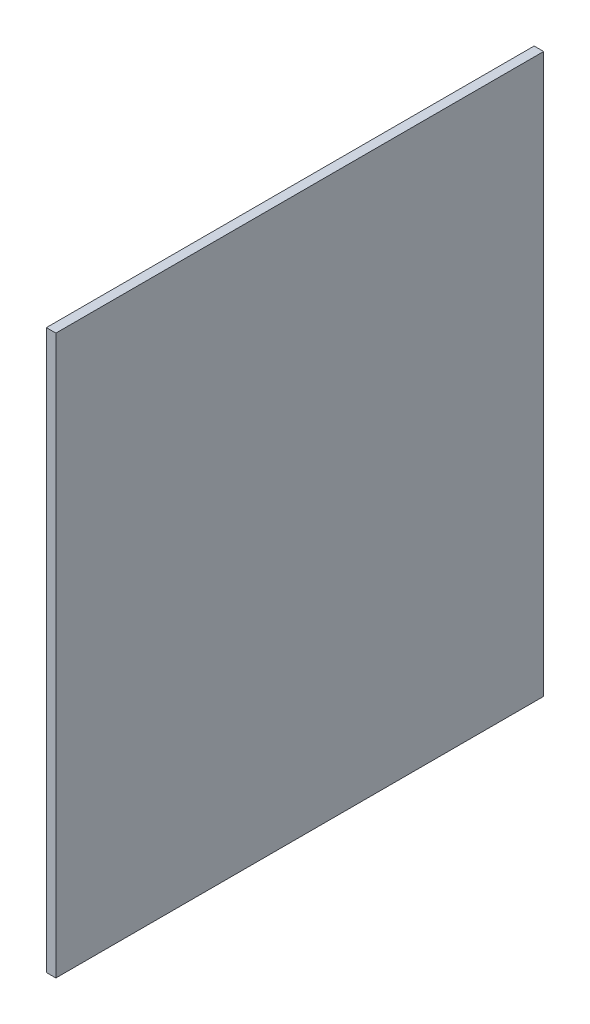
ISO-10303-21;
HEADER;
FILE_DESCRIPTION(('STEP AP214'),'2;1');
FILE_NAME('part.step','',(''),(''),'','','');
FILE_SCHEMA(('AUTOMOTIVE_DESIGN { 1 0 10303 214 1 1 1 1 }'));
ENDSEC;
DATA;
#1=APPLICATION_CONTEXT('core data for automotive mechanical design processes');
#2=APPLICATION_PROTOCOL_DEFINITION('international standard','automotive_design',2000,#1);
#3=PRODUCT_CONTEXT('',#1,'mechanical');
#4=PRODUCT('Part','Part','',(#3));
#5=PRODUCT_RELATED_PRODUCT_CATEGORY('part','',(#4));
#6=PRODUCT_DEFINITION_FORMATION('','',#4);
#7=PRODUCT_DEFINITION_CONTEXT('part definition',#1,'design');
#8=PRODUCT_DEFINITION('design','',#6,#7);
#9=PRODUCT_DEFINITION_SHAPE('','',#8);
#10=(LENGTH_UNIT() NAMED_UNIT(*) SI_UNIT(.MILLI.,.METRE.));
#11=(NAMED_UNIT(*) PLANE_ANGLE_UNIT() SI_UNIT($,.RADIAN.));
#12=(NAMED_UNIT(*) SI_UNIT($,.STERADIAN.) SOLID_ANGLE_UNIT());
#13=UNCERTAINTY_MEASURE_WITH_UNIT(LENGTH_MEASURE(1.E-05),#10,'distance_accuracy_value','');
#14=(GEOMETRIC_REPRESENTATION_CONTEXT(3) GLOBAL_UNCERTAINTY_ASSIGNED_CONTEXT((#13)) GLOBAL_UNIT_ASSIGNED_CONTEXT((#10,
#11,#12)) REPRESENTATION_CONTEXT('',''));
#15=CARTESIAN_POINT('',(0.,0.,0.));
#16=DIRECTION('',(0.,0.,1.));
#17=DIRECTION('',(1.,0.,0.));
#18=AXIS2_PLACEMENT_3D('',#15,#16,#17);
#19=CARTESIAN_POINT('',(2.54,0.,0.));
#20=DIRECTION('',(0.,0.,-1.));
#21=DIRECTION('',(-1.,0.,0.));
#22=AXIS2_PLACEMENT_3D('',#19,#20,#21);
#23=PLANE('',#22);
#24=DIRECTION('',(0.,-1.,0.));
#25=VECTOR('',#24,1.);
#26=CARTESIAN_POINT('',(0.,0.,0.));
#27=LINE('',#26,#25);
#28=CARTESIAN_POINT('',(0.,149.2,0.));
#29=VERTEX_POINT('',#28);
#30=CARTESIAN_POINT('',(0.,0.,0.));
#31=VERTEX_POINT('',#30);
#32=EDGE_CURVE('E96',#29,#31,#27,.T.);
#33=ORIENTED_EDGE('',*,*,#32,.T.);
#34=DIRECTION('',(-1.,0.,0.));
#35=VECTOR('',#34,1.);
#36=CARTESIAN_POINT('',(2.54,0.,0.));
#37=LINE('',#36,#35);
#38=CARTESIAN_POINT('',(2.54,0.,0.));
#39=VERTEX_POINT('',#38);
#40=EDGE_CURVE('E11',#39,#31,#37,.T.);
#41=ORIENTED_EDGE('',*,*,#40,.F.);
#42=DIRECTION('',(0.,-1.,0.));
#43=VECTOR('',#42,1.);
#44=CARTESIAN_POINT('',(2.54,0.,0.));
#45=LINE('',#44,#43);
#46=CARTESIAN_POINT('',(2.54,149.2,0.));
#47=VERTEX_POINT('',#46);
#48=EDGE_CURVE('E84',#47,#39,#45,.T.);
#49=ORIENTED_EDGE('',*,*,#48,.F.);
#50=DIRECTION('',(-1.,0.,0.));
#51=VECTOR('',#50,1.);
#52=CARTESIAN_POINT('',(2.54,149.2,0.));
#53=LINE('',#52,#51);
#54=EDGE_CURVE('E92',#47,#29,#53,.T.);
#55=ORIENTED_EDGE('',*,*,#54,.T.);
#56=EDGE_LOOP('',(#33,#41,#49,#55));
#57=FACE_BOUND('',#56,.T.);
#58=ADVANCED_FACE('F33',(#57),#23,.F.);
#59=CARTESIAN_POINT('',(2.54,0.,0.));
#60=DIRECTION('',(0.,1.,0.));
#61=DIRECTION('',(0.,0.,1.));
#62=AXIS2_PLACEMENT_3D('',#59,#60,#61);
#63=PLANE('',#62);
#64=DIRECTION('',(0.,0.,-1.));
#65=VECTOR('',#64,1.);
#66=CARTESIAN_POINT('',(0.,0.,0.));
#67=LINE('',#66,#65);
#68=CARTESIAN_POINT('',(0.,0.,-130.3));
#69=VERTEX_POINT('',#68);
#70=EDGE_CURVE('E88',#31,#69,#67,.T.);
#71=ORIENTED_EDGE('',*,*,#70,.T.);
#72=DIRECTION('',(-1.,0.,0.));
#73=VECTOR('',#72,1.);
#74=CARTESIAN_POINT('',(2.54,0.,-130.3));
#75=LINE('',#74,#73);
#76=CARTESIAN_POINT('',(2.54,0.,-130.3));
#77=VERTEX_POINT('',#76);
#78=EDGE_CURVE('E41',#77,#69,#75,.T.);
#79=ORIENTED_EDGE('',*,*,#78,.F.);
#80=DIRECTION('',(0.,0.,-1.));
#81=VECTOR('',#80,1.);
#82=CARTESIAN_POINT('',(2.54,0.,0.));
#83=LINE('',#82,#81);
#84=EDGE_CURVE('E79',#39,#77,#83,.T.);
#85=ORIENTED_EDGE('',*,*,#84,.F.);
#86=ORIENTED_EDGE('',*,*,#40,.T.);
#87=EDGE_LOOP('',(#71,#79,#85,#86));
#88=FACE_BOUND('',#87,.T.);
#89=ADVANCED_FACE('F87',(#88),#63,.F.);
#90=CARTESIAN_POINT('',(2.54,0.,-130.3));
#91=DIRECTION('',(0.,0.,1.));
#92=DIRECTION('',(0.,-1.,0.));
#93=AXIS2_PLACEMENT_3D('',#90,#91,#92);
#94=PLANE('',#93);
#95=DIRECTION('',(0.,1.,0.));
#96=VECTOR('',#95,1.);
#97=CARTESIAN_POINT('',(0.,0.,-130.3));
#98=LINE('',#97,#96);
#99=CARTESIAN_POINT('',(0.,149.2,-130.3));
#100=VERTEX_POINT('',#99);
#101=EDGE_CURVE('E66',#69,#100,#98,.T.);
#102=ORIENTED_EDGE('',*,*,#101,.T.);
#103=DIRECTION('',(-1.,0.,0.));
#104=VECTOR('',#103,1.);
#105=CARTESIAN_POINT('',(2.54,149.2,-130.3));
#106=LINE('',#105,#104);
#107=CARTESIAN_POINT('',(2.54,149.2,-130.3));
#108=VERTEX_POINT('',#107);
#109=EDGE_CURVE('E89',#108,#100,#106,.T.);
#110=ORIENTED_EDGE('',*,*,#109,.F.);
#111=DIRECTION('',(0.,1.,0.));
#112=VECTOR('',#111,1.);
#113=CARTESIAN_POINT('',(2.54,0.,-130.3));
#114=LINE('',#113,#112);
#115=EDGE_CURVE('E82',#77,#108,#114,.T.);
#116=ORIENTED_EDGE('',*,*,#115,.F.);
#117=ORIENTED_EDGE('',*,*,#78,.T.);
#118=EDGE_LOOP('',(#102,#110,#116,#117));
#119=FACE_BOUND('',#118,.T.);
#120=ADVANCED_FACE('F90',(#119),#94,.F.);
#121=CARTESIAN_POINT('',(2.54,149.2,0.));
#122=DIRECTION('',(0.,-1.,0.));
#123=DIRECTION('',(0.,0.,-1.));
#124=AXIS2_PLACEMENT_3D('',#121,#122,#123);
#125=PLANE('',#124);
#126=DIRECTION('',(0.,0.,1.));
#127=VECTOR('',#126,1.);
#128=CARTESIAN_POINT('',(0.,149.2,0.));
#129=LINE('',#128,#127);
#130=EDGE_CURVE('E72',#100,#29,#129,.T.);
#131=ORIENTED_EDGE('',*,*,#130,.T.);
#132=ORIENTED_EDGE('',*,*,#54,.F.);
#133=DIRECTION('',(0.,0.,1.));
#134=VECTOR('',#133,1.);
#135=CARTESIAN_POINT('',(2.54,149.2,0.));
#136=LINE('',#135,#134);
#137=EDGE_CURVE('E49',#108,#47,#136,.T.);
#138=ORIENTED_EDGE('',*,*,#137,.F.);
#139=ORIENTED_EDGE('',*,*,#109,.T.);
#140=EDGE_LOOP('',(#131,#132,#138,#139));
#141=FACE_BOUND('',#140,.T.);
#142=ADVANCED_FACE('F103',(#141),#125,.F.);
#143=CARTESIAN_POINT('',(2.54,0.,0.));
#144=DIRECTION('',(-1.,0.,0.));
#145=DIRECTION('',(0.,0.,1.));
#146=AXIS2_PLACEMENT_3D('',#143,#144,#145);
#147=PLANE('',#146);
#148=ORIENTED_EDGE('',*,*,#48,.T.);
#149=ORIENTED_EDGE('',*,*,#84,.T.);
#150=ORIENTED_EDGE('',*,*,#115,.T.);
#151=ORIENTED_EDGE('',*,*,#137,.T.);
#152=EDGE_LOOP('',(#148,#149,#150,#151));
#153=FACE_BOUND('',#152,.T.);
#154=ADVANCED_FACE('F80',(#153),#147,.F.);
#155=CARTESIAN_POINT('',(0.,0.,0.));
#156=DIRECTION('',(-1.,0.,0.));
#157=DIRECTION('',(0.,0.,1.));
#158=AXIS2_PLACEMENT_3D('',#155,#156,#157);
#159=PLANE('',#158);
#160=ORIENTED_EDGE('',*,*,#32,.F.);
#161=ORIENTED_EDGE('',*,*,#130,.F.);
#162=ORIENTED_EDGE('',*,*,#101,.F.);
#163=ORIENTED_EDGE('',*,*,#70,.F.);
#164=EDGE_LOOP('',(#160,#161,#162,#163));
#165=FACE_BOUND('',#164,.T.);
#166=ADVANCED_FACE('F106',(#165),#159,.T.);
#167=CLOSED_SHELL('',(#58,#89,#120,#142,#154,#166));
#168=MANIFOLD_SOLID_BREP('B2',#167);
#169=ADVANCED_BREP_SHAPE_REPRESENTATION('',(#18,#168),#14);
#170=SHAPE_DEFINITION_REPRESENTATION(#9,#169);
ENDSEC;
END-ISO-10303-21;
